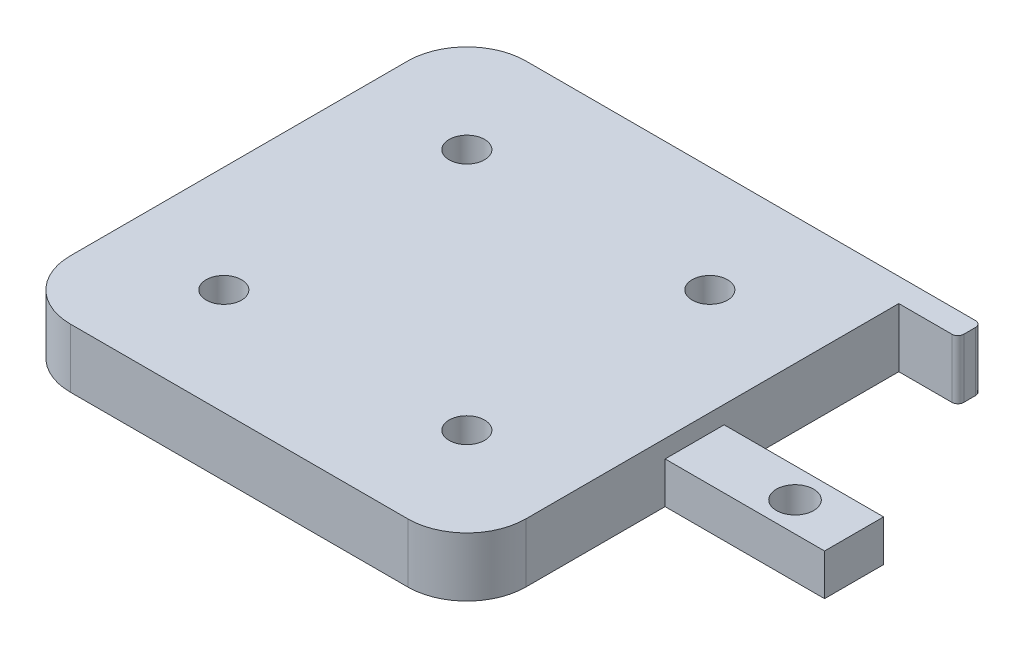
ISO-10303-21;
HEADER;
FILE_DESCRIPTION(('STEP AP214'),'2;1');
FILE_NAME('part.step','',(''),(''),'','','');
FILE_SCHEMA(('AUTOMOTIVE_DESIGN { 1 0 10303 214 1 1 1 1 }'));
ENDSEC;
DATA;
#1=APPLICATION_CONTEXT('core data for automotive mechanical design processes');
#2=APPLICATION_PROTOCOL_DEFINITION('international standard','automotive_design',2000,#1);
#3=PRODUCT_CONTEXT('',#1,'mechanical');
#4=PRODUCT('Part','Part','',(#3));
#5=PRODUCT_RELATED_PRODUCT_CATEGORY('part','',(#4));
#6=PRODUCT_DEFINITION_FORMATION('','',#4);
#7=PRODUCT_DEFINITION_CONTEXT('part definition',#1,'design');
#8=PRODUCT_DEFINITION('design','',#6,#7);
#9=PRODUCT_DEFINITION_SHAPE('','',#8);
#10=(LENGTH_UNIT() NAMED_UNIT(*) SI_UNIT(.MILLI.,.METRE.));
#11=(NAMED_UNIT(*) PLANE_ANGLE_UNIT() SI_UNIT($,.RADIAN.));
#12=(NAMED_UNIT(*) SI_UNIT($,.STERADIAN.) SOLID_ANGLE_UNIT());
#13=UNCERTAINTY_MEASURE_WITH_UNIT(LENGTH_MEASURE(1.E-05),#10,'distance_accuracy_value','');
#14=(GEOMETRIC_REPRESENTATION_CONTEXT(3) GLOBAL_UNCERTAINTY_ASSIGNED_CONTEXT((#13)) GLOBAL_UNIT_ASSIGNED_CONTEXT((#10,
#11,#12)) REPRESENTATION_CONTEXT('',''));
#15=CARTESIAN_POINT('',(0.,0.,0.));
#16=DIRECTION('',(0.,0.,1.));
#17=DIRECTION('',(1.,0.,0.));
#18=AXIS2_PLACEMENT_3D('',#15,#16,#17);
#19=CARTESIAN_POINT('',(38.575,10.,-38.575));
#20=DIRECTION('',(-1.,0.,0.));
#21=DIRECTION('',(0.,0.,1.));
#22=AXIS2_PLACEMENT_3D('',#19,#20,#21);
#23=PLANE('',#22);
#24=DIRECTION('',(0.,-1.,0.));
#25=VECTOR('',#24,1.);
#26=CARTESIAN_POINT('',(38.575,10.,-34.575));
#27=LINE('',#26,#25);
#28=CARTESIAN_POINT('',(38.575,10.,-34.575));
#29=VERTEX_POINT('',#28);
#30=CARTESIAN_POINT('',(38.575,0.,-34.575));
#31=VERTEX_POINT('',#30);
#32=EDGE_CURVE('E140',#29,#31,#27,.T.);
#33=ORIENTED_EDGE('',*,*,#32,.F.);
#34=DIRECTION('',(0.,0.,-1.));
#35=VECTOR('',#34,1.);
#36=CARTESIAN_POINT('',(38.575,10.,-38.575));
#37=LINE('',#36,#35);
#38=CARTESIAN_POINT('',(38.575,10.,28.575));
#39=VERTEX_POINT('',#38);
#40=EDGE_CURVE('E150',#39,#29,#37,.T.);
#41=ORIENTED_EDGE('',*,*,#40,.F.);
#42=DIRECTION('',(0.,-1.,0.));
#43=VECTOR('',#42,1.);
#44=CARTESIAN_POINT('',(38.575,10.,28.575));
#45=LINE('',#44,#43);
#46=CARTESIAN_POINT('',(38.575,0.,28.575));
#47=VERTEX_POINT('',#46);
#48=EDGE_CURVE('E204',#39,#47,#45,.T.);
#49=ORIENTED_EDGE('',*,*,#48,.T.);
#50=DIRECTION('',(0.,0.,-1.));
#51=VECTOR('',#50,1.);
#52=CARTESIAN_POINT('',(38.575,0.,-38.575));
#53=LINE('',#52,#51);
#54=CARTESIAN_POINT('',(38.575,0.,4.99999999999998));
#55=VERTEX_POINT('',#54);
#56=EDGE_CURVE('E178',#47,#55,#53,.T.);
#57=ORIENTED_EDGE('',*,*,#56,.T.);
#58=DIRECTION('',(0.,-1.,0.));
#59=VECTOR('',#58,1.);
#60=CARTESIAN_POINT('',(38.575,7.,5.));
#61=LINE('',#60,#59);
#62=CARTESIAN_POINT('',(38.575,7.,5.));
#63=VERTEX_POINT('',#62);
#64=EDGE_CURVE('E260',#63,#55,#61,.T.);
#65=ORIENTED_EDGE('',*,*,#64,.F.);
#66=DIRECTION('',(0.,0.,1.));
#67=VECTOR('',#66,1.);
#68=CARTESIAN_POINT('',(38.575,7.,-5.));
#69=LINE('',#68,#67);
#70=CARTESIAN_POINT('',(38.575,7.,-5.));
#71=VERTEX_POINT('',#70);
#72=EDGE_CURVE('E257',#71,#63,#69,.T.);
#73=ORIENTED_EDGE('',*,*,#72,.F.);
#74=DIRECTION('',(0.,1.,0.));
#75=VECTOR('',#74,1.);
#76=CARTESIAN_POINT('',(38.575,0.,-5.));
#77=LINE('',#76,#75);
#78=CARTESIAN_POINT('',(38.575,0.,-5.));
#79=VERTEX_POINT('',#78);
#80=EDGE_CURVE('E252',#79,#71,#77,.T.);
#81=ORIENTED_EDGE('',*,*,#80,.F.);
#82=EDGE_CURVE('E154',#79,#31,#53,.T.);
#83=ORIENTED_EDGE('',*,*,#82,.T.);
#84=EDGE_LOOP('',(#33,#41,#49,#57,#65,#73,#81,#83));
#85=FACE_BOUND('',#84,.T.);
#86=ADVANCED_FACE('F32',(#85),#23,.F.);
#87=CARTESIAN_POINT('',(0.,0.,0.));
#88=DIRECTION('',(0.,-1.,0.));
#89=DIRECTION('',(0.,0.,-1.));
#90=AXIS2_PLACEMENT_3D('',#87,#88,#89);
#91=PLANE('',#90);
#92=CARTESIAN_POINT('',(20.575,0.,-20.575));
#93=DIRECTION('',(0.,1.,0.));
#94=DIRECTION('',(0.,0.,1.));
#95=AXIS2_PLACEMENT_3D('',#92,#93,#94);
#96=CIRCLE('',#95,3.);
#97=CARTESIAN_POINT('',(20.575,0.,-17.575));
#98=VERTEX_POINT('',#97);
#99=EDGE_CURVE('E275',#98,#98,#96,.T.);
#100=ORIENTED_EDGE('',*,*,#99,.T.);
#101=EDGE_LOOP('',(#100));
#102=FACE_BOUND('',#101,.T.);
#103=CARTESIAN_POINT('',(-20.575,0.,20.575));
#104=DIRECTION('',(0.,1.,0.));
#105=DIRECTION('',(0.,0.,1.));
#106=AXIS2_PLACEMENT_3D('',#103,#104,#105);
#107=CIRCLE('',#106,3.);
#108=CARTESIAN_POINT('',(-20.575,0.,23.575));
#109=VERTEX_POINT('',#108);
#110=EDGE_CURVE('E287',#109,#109,#107,.T.);
#111=ORIENTED_EDGE('',*,*,#110,.T.);
#112=EDGE_LOOP('',(#111));
#113=FACE_BOUND('',#112,.T.);
#114=CARTESIAN_POINT('',(-20.575,0.,-20.575));
#115=DIRECTION('',(0.,1.,0.));
#116=DIRECTION('',(0.,0.,1.));
#117=AXIS2_PLACEMENT_3D('',#114,#115,#116);
#118=CIRCLE('',#117,3.);
#119=CARTESIAN_POINT('',(-20.575,0.,-17.575));
#120=VERTEX_POINT('',#119);
#121=EDGE_CURVE('E281',#120,#120,#118,.T.);
#122=ORIENTED_EDGE('',*,*,#121,.T.);
#123=EDGE_LOOP('',(#122));
#124=FACE_BOUND('',#123,.T.);
#125=CARTESIAN_POINT('',(20.575,0.,20.575));
#126=DIRECTION('',(0.,1.,0.));
#127=DIRECTION('',(0.,0.,1.));
#128=AXIS2_PLACEMENT_3D('',#125,#126,#127);
#129=CIRCLE('',#128,3.);
#130=CARTESIAN_POINT('',(20.575,0.,23.575));
#131=VERTEX_POINT('',#130);
#132=EDGE_CURVE('E271',#131,#131,#129,.T.);
#133=ORIENTED_EDGE('',*,*,#132,.T.);
#134=EDGE_LOOP('',(#133));
#135=FACE_BOUND('',#134,.T.);
#136=DIRECTION('',(0.,0.,-1.));
#137=VECTOR('',#136,1.);
#138=CARTESIAN_POINT('',(48.575,0.,-34.575));
#139=LINE('',#138,#137);
#140=CARTESIAN_POINT('',(48.575,0.,-35.575));
#141=VERTEX_POINT('',#140);
#142=CARTESIAN_POINT('',(48.575,0.,-37.575));
#143=VERTEX_POINT('',#142);
#144=EDGE_CURVE('E230',#141,#143,#139,.T.);
#145=ORIENTED_EDGE('',*,*,#144,.F.);
#146=CARTESIAN_POINT('',(47.575,0.,-35.575));
#147=DIRECTION('',(0.,-1.,0.));
#148=DIRECTION('',(0.,0.,-1.));
#149=AXIS2_PLACEMENT_3D('',#146,#147,#148);
#150=CIRCLE('',#149,1.);
#151=CARTESIAN_POINT('',(47.575,0.,-34.575));
#152=VERTEX_POINT('',#151);
#153=EDGE_CURVE('E219',#141,#152,#150,.T.);
#154=ORIENTED_EDGE('',*,*,#153,.T.);
#155=DIRECTION('',(-1.,0.,0.));
#156=VECTOR('',#155,1.);
#157=CARTESIAN_POINT('',(48.575,0.,-34.575));
#158=LINE('',#157,#156);
#159=EDGE_CURVE('E145',#152,#31,#158,.T.);
#160=ORIENTED_EDGE('',*,*,#159,.T.);
#161=ORIENTED_EDGE('',*,*,#82,.F.);
#162=DIRECTION('',(-1.,0.,0.));
#163=VECTOR('',#162,1.);
#164=CARTESIAN_POINT('',(68.575,0.,-5.));
#165=LINE('',#164,#163);
#166=CARTESIAN_POINT('',(65.575,0.,-5.));
#167=VERTEX_POINT('',#166);
#168=EDGE_CURVE('E263',#167,#79,#165,.T.);
#169=ORIENTED_EDGE('',*,*,#168,.F.);
#170=DIRECTION('',(0.,0.,1.));
#171=VECTOR('',#170,1.);
#172=CARTESIAN_POINT('',(65.575,0.,0.));
#173=LINE('',#172,#171);
#174=CARTESIAN_POINT('',(65.575,0.,5.));
#175=VERTEX_POINT('',#174);
#176=EDGE_CURVE('E245',#167,#175,#173,.T.);
#177=ORIENTED_EDGE('',*,*,#176,.T.);
#178=DIRECTION('',(-1.,0.,0.));
#179=VECTOR('',#178,1.);
#180=CARTESIAN_POINT('',(68.575,0.,5.));
#181=LINE('',#180,#179);
#182=EDGE_CURVE('E265',#175,#55,#181,.T.);
#183=ORIENTED_EDGE('',*,*,#182,.T.);
#184=ORIENTED_EDGE('',*,*,#56,.F.);
#185=CARTESIAN_POINT('',(28.575,0.,28.575));
#186=DIRECTION('',(0.,-1.,0.));
#187=DIRECTION('',(0.,0.,-1.));
#188=AXIS2_PLACEMENT_3D('',#185,#186,#187);
#189=CIRCLE('',#188,10.);
#190=CARTESIAN_POINT('',(28.575,0.,38.575));
#191=VERTEX_POINT('',#190);
#192=EDGE_CURVE('E191',#47,#191,#189,.T.);
#193=ORIENTED_EDGE('',*,*,#192,.T.);
#194=DIRECTION('',(1.,0.,0.));
#195=VECTOR('',#194,1.);
#196=CARTESIAN_POINT('',(38.575,0.,38.575));
#197=LINE('',#196,#195);
#198=CARTESIAN_POINT('',(-28.575,0.,38.575));
#199=VERTEX_POINT('',#198);
#200=EDGE_CURVE('E174',#199,#191,#197,.T.);
#201=ORIENTED_EDGE('',*,*,#200,.F.);
#202=CARTESIAN_POINT('',(-28.575,0.,28.575));
#203=DIRECTION('',(0.,-1.,0.));
#204=DIRECTION('',(0.,0.,-1.));
#205=AXIS2_PLACEMENT_3D('',#202,#203,#204);
#206=CIRCLE('',#205,10.);
#207=CARTESIAN_POINT('',(-38.575,0.,28.575));
#208=VERTEX_POINT('',#207);
#209=EDGE_CURVE('E189',#199,#208,#206,.T.);
#210=ORIENTED_EDGE('',*,*,#209,.T.);
#211=DIRECTION('',(0.,0.,1.));
#212=VECTOR('',#211,1.);
#213=CARTESIAN_POINT('',(-38.575,0.,38.575));
#214=LINE('',#213,#212);
#215=CARTESIAN_POINT('',(-38.575,0.,-28.575));
#216=VERTEX_POINT('',#215);
#217=EDGE_CURVE('E167',#216,#208,#214,.T.);
#218=ORIENTED_EDGE('',*,*,#217,.F.);
#219=CARTESIAN_POINT('',(-28.575,0.,-28.575));
#220=DIRECTION('',(0.,-1.,0.));
#221=DIRECTION('',(0.,0.,-1.));
#222=AXIS2_PLACEMENT_3D('',#219,#220,#221);
#223=CIRCLE('',#222,10.);
#224=CARTESIAN_POINT('',(-28.575,0.,-38.575));
#225=VERTEX_POINT('',#224);
#226=EDGE_CURVE('E193',#216,#225,#223,.T.);
#227=ORIENTED_EDGE('',*,*,#226,.T.);
#228=DIRECTION('',(-1.,0.,0.));
#229=VECTOR('',#228,1.);
#230=CARTESIAN_POINT('',(-38.575,0.,-38.575));
#231=LINE('',#230,#229);
#232=CARTESIAN_POINT('',(47.575,0.,-38.575));
#233=VERTEX_POINT('',#232);
#234=EDGE_CURVE('E181',#233,#225,#231,.T.);
#235=ORIENTED_EDGE('',*,*,#234,.F.);
#236=CARTESIAN_POINT('',(47.575,0.,-37.575));
#237=DIRECTION('',(0.,-1.,0.));
#238=DIRECTION('',(0.,0.,-1.));
#239=AXIS2_PLACEMENT_3D('',#236,#237,#238);
#240=CIRCLE('',#239,1.);
#241=EDGE_CURVE('E217',#233,#143,#240,.T.);
#242=ORIENTED_EDGE('',*,*,#241,.T.);
#243=EDGE_LOOP('',(#145,#154,#160,#161,#169,#177,#183,#184,#193,#201,#210,#218,#227,#235,#242));
#244=FACE_BOUND('',#243,.T.);
#245=ADVANCED_FACE('F234',(#102,#113,#124,#135,#244),#91,.T.);
#246=CARTESIAN_POINT('',(68.575,0.,-5.));
#247=DIRECTION('',(0.,0.,1.));
#248=DIRECTION('',(1.,0.,0.));
#249=AXIS2_PLACEMENT_3D('',#246,#247,#248);
#250=PLANE('',#249);
#251=DIRECTION('',(0.,1.,0.));
#252=VECTOR('',#251,1.);
#253=CARTESIAN_POINT('',(65.575,-36.,-5.));
#254=LINE('',#253,#252);
#255=CARTESIAN_POINT('',(65.575,7.,-5.));
#256=VERTEX_POINT('',#255);
#257=EDGE_CURVE('E240',#167,#256,#254,.T.);
#258=ORIENTED_EDGE('',*,*,#257,.F.);
#259=ORIENTED_EDGE('',*,*,#168,.T.);
#260=ORIENTED_EDGE('',*,*,#80,.T.);
#261=DIRECTION('',(-1.,0.,0.));
#262=VECTOR('',#261,1.);
#263=CARTESIAN_POINT('',(68.575,7.,-5.));
#264=LINE('',#263,#262);
#265=EDGE_CURVE('E269',#256,#71,#264,.T.);
#266=ORIENTED_EDGE('',*,*,#265,.F.);
#267=EDGE_LOOP('',(#258,#259,#260,#266));
#268=FACE_BOUND('',#267,.T.);
#269=ADVANCED_FACE('F318',(#268),#250,.F.);
#270=CARTESIAN_POINT('',(68.575,7.,-5.));
#271=DIRECTION('',(0.,-1.,0.));
#272=DIRECTION('',(0.,0.,-1.));
#273=AXIS2_PLACEMENT_3D('',#270,#271,#272);
#274=PLANE('',#273);
#275=CARTESIAN_POINT('',(55.575,7.,0.));
#276=DIRECTION('',(0.,-1.,0.));
#277=DIRECTION('',(0.,0.,-1.));
#278=AXIS2_PLACEMENT_3D('',#275,#276,#277);
#279=CIRCLE('',#278,3.15);
#280=CARTESIAN_POINT('',(55.575,7.,-3.15));
#281=VERTEX_POINT('',#280);
#282=EDGE_CURVE('E248',#281,#281,#279,.T.);
#283=ORIENTED_EDGE('',*,*,#282,.T.);
#284=EDGE_LOOP('',(#283));
#285=FACE_BOUND('',#284,.T.);
#286=DIRECTION('',(0.,0.,-1.));
#287=VECTOR('',#286,1.);
#288=CARTESIAN_POINT('',(65.575,7.,-5.));
#289=LINE('',#288,#287);
#290=CARTESIAN_POINT('',(65.575,7.,5.));
#291=VERTEX_POINT('',#290);
#292=EDGE_CURVE('E144',#291,#256,#289,.T.);
#293=ORIENTED_EDGE('',*,*,#292,.T.);
#294=ORIENTED_EDGE('',*,*,#265,.T.);
#295=ORIENTED_EDGE('',*,*,#72,.T.);
#296=DIRECTION('',(-1.,0.,0.));
#297=VECTOR('',#296,1.);
#298=CARTESIAN_POINT('',(68.575,7.,5.));
#299=LINE('',#298,#297);
#300=EDGE_CURVE('E267',#291,#63,#299,.T.);
#301=ORIENTED_EDGE('',*,*,#300,.F.);
#302=EDGE_LOOP('',(#293,#294,#295,#301));
#303=FACE_BOUND('',#302,.T.);
#304=ADVANCED_FACE('F366',(#285,#303),#274,.F.);
#305=CARTESIAN_POINT('',(68.575,7.,5.));
#306=DIRECTION('',(0.,0.,-1.));
#307=DIRECTION('',(0.,1.,0.));
#308=AXIS2_PLACEMENT_3D('',#305,#306,#307);
#309=PLANE('',#308);
#310=DIRECTION('',(0.,1.,0.));
#311=VECTOR('',#310,1.);
#312=CARTESIAN_POINT('',(65.575,-36.,5.));
#313=LINE('',#312,#311);
#314=EDGE_CURVE('E242',#175,#291,#313,.T.);
#315=ORIENTED_EDGE('',*,*,#314,.T.);
#316=ORIENTED_EDGE('',*,*,#300,.T.);
#317=ORIENTED_EDGE('',*,*,#64,.T.);
#318=ORIENTED_EDGE('',*,*,#182,.F.);
#319=EDGE_LOOP('',(#315,#316,#317,#318));
#320=FACE_BOUND('',#319,.T.);
#321=ADVANCED_FACE('F363',(#320),#309,.F.);
#322=CARTESIAN_POINT('',(0.,10.,0.));
#323=DIRECTION('',(0.,-1.,0.));
#324=DIRECTION('',(0.,0.,-1.));
#325=AXIS2_PLACEMENT_3D('',#322,#323,#324);
#326=PLANE('',#325);
#327=DIRECTION('',(-1.,0.,0.));
#328=VECTOR('',#327,1.);
#329=CARTESIAN_POINT('',(48.575,10.,-34.575));
#330=LINE('',#329,#328);
#331=CARTESIAN_POINT('',(47.575,10.,-34.575));
#332=VERTEX_POINT('',#331);
#333=EDGE_CURVE('E137',#332,#29,#330,.T.);
#334=ORIENTED_EDGE('',*,*,#333,.F.);
#335=CARTESIAN_POINT('',(47.575,10.,-35.575));
#336=DIRECTION('',(0.,-1.,0.));
#337=DIRECTION('',(0.,0.,-1.));
#338=AXIS2_PLACEMENT_3D('',#335,#336,#337);
#339=CIRCLE('',#338,1.);
#340=CARTESIAN_POINT('',(48.575,10.,-35.575));
#341=VERTEX_POINT('',#340);
#342=EDGE_CURVE('E40',#332,#341,#339,.F.);
#343=ORIENTED_EDGE('',*,*,#342,.T.);
#344=DIRECTION('',(0.,0.,1.));
#345=VECTOR('',#344,1.);
#346=CARTESIAN_POINT('',(48.575,10.,-38.575));
#347=LINE('',#346,#345);
#348=CARTESIAN_POINT('',(48.575,10.,-37.575));
#349=VERTEX_POINT('',#348);
#350=EDGE_CURVE('E155',#349,#341,#347,.T.);
#351=ORIENTED_EDGE('',*,*,#350,.F.);
#352=CARTESIAN_POINT('',(47.575,10.,-37.575));
#353=DIRECTION('',(0.,-1.,0.));
#354=DIRECTION('',(0.,0.,-1.));
#355=AXIS2_PLACEMENT_3D('',#352,#353,#354);
#356=CIRCLE('',#355,1.);
#357=CARTESIAN_POINT('',(47.575,10.,-38.575));
#358=VERTEX_POINT('',#357);
#359=EDGE_CURVE('E47',#349,#358,#356,.F.);
#360=ORIENTED_EDGE('',*,*,#359,.T.);
#361=DIRECTION('',(-1.,0.,0.));
#362=VECTOR('',#361,1.);
#363=CARTESIAN_POINT('',(-38.575,10.,-38.575));
#364=LINE('',#363,#362);
#365=CARTESIAN_POINT('',(-28.575,10.,-38.575));
#366=VERTEX_POINT('',#365);
#367=EDGE_CURVE('E162',#358,#366,#364,.T.);
#368=ORIENTED_EDGE('',*,*,#367,.T.);
#369=CARTESIAN_POINT('',(-28.575,10.,-28.575));
#370=DIRECTION('',(0.,-1.,0.));
#371=DIRECTION('',(0.,0.,-1.));
#372=AXIS2_PLACEMENT_3D('',#369,#370,#371);
#373=CIRCLE('',#372,10.);
#374=CARTESIAN_POINT('',(-38.575,10.,-28.575));
#375=VERTEX_POINT('',#374);
#376=EDGE_CURVE('E202',#366,#375,#373,.F.);
#377=ORIENTED_EDGE('',*,*,#376,.T.);
#378=DIRECTION('',(0.,0.,1.));
#379=VECTOR('',#378,1.);
#380=CARTESIAN_POINT('',(-38.575,10.,38.575));
#381=LINE('',#380,#379);
#382=CARTESIAN_POINT('',(-38.575,10.,28.575));
#383=VERTEX_POINT('',#382);
#384=EDGE_CURVE('E165',#375,#383,#381,.T.);
#385=ORIENTED_EDGE('',*,*,#384,.T.);
#386=CARTESIAN_POINT('',(-28.575,10.,28.575));
#387=DIRECTION('',(0.,-1.,0.));
#388=DIRECTION('',(0.,0.,-1.));
#389=AXIS2_PLACEMENT_3D('',#386,#387,#388);
#390=CIRCLE('',#389,10.);
#391=CARTESIAN_POINT('',(-28.575,10.,38.575));
#392=VERTEX_POINT('',#391);
#393=EDGE_CURVE('E199',#383,#392,#390,.F.);
#394=ORIENTED_EDGE('',*,*,#393,.T.);
#395=DIRECTION('',(1.,0.,0.));
#396=VECTOR('',#395,1.);
#397=CARTESIAN_POINT('',(38.575,10.,38.575));
#398=LINE('',#397,#396);
#399=CARTESIAN_POINT('',(28.575,10.,38.575));
#400=VERTEX_POINT('',#399);
#401=EDGE_CURVE('E163',#392,#400,#398,.T.);
#402=ORIENTED_EDGE('',*,*,#401,.T.);
#403=CARTESIAN_POINT('',(28.575,10.,28.575));
#404=DIRECTION('',(0.,-1.,0.));
#405=DIRECTION('',(0.,0.,-1.));
#406=AXIS2_PLACEMENT_3D('',#403,#404,#405);
#407=CIRCLE('',#406,10.);
#408=EDGE_CURVE('E161',#400,#39,#407,.F.);
#409=ORIENTED_EDGE('',*,*,#408,.T.);
#410=ORIENTED_EDGE('',*,*,#40,.T.);
#411=EDGE_LOOP('',(#334,#343,#351,#360,#368,#377,#385,#394,#402,#409,#410));
#412=FACE_BOUND('',#411,.T.);
#413=CARTESIAN_POINT('',(-20.575,10.,20.575));
#414=DIRECTION('',(0.,1.,0.));
#415=DIRECTION('',(0.,0.,1.));
#416=AXIS2_PLACEMENT_3D('',#413,#414,#415);
#417=CIRCLE('',#416,3.);
#418=CARTESIAN_POINT('',(-20.575,10.,23.575));
#419=VERTEX_POINT('',#418);
#420=EDGE_CURVE('E177',#419,#419,#417,.T.);
#421=ORIENTED_EDGE('',*,*,#420,.F.);
#422=EDGE_LOOP('',(#421));
#423=FACE_BOUND('',#422,.T.);
#424=CARTESIAN_POINT('',(-20.575,10.,-20.575));
#425=DIRECTION('',(0.,1.,0.));
#426=DIRECTION('',(0.,0.,1.));
#427=AXIS2_PLACEMENT_3D('',#424,#425,#426);
#428=CIRCLE('',#427,3.);
#429=CARTESIAN_POINT('',(-20.575,10.,-17.575));
#430=VERTEX_POINT('',#429);
#431=EDGE_CURVE('E284',#430,#430,#428,.T.);
#432=ORIENTED_EDGE('',*,*,#431,.F.);
#433=EDGE_LOOP('',(#432));
#434=FACE_BOUND('',#433,.T.);
#435=CARTESIAN_POINT('',(20.575,10.,-20.575));
#436=DIRECTION('',(0.,1.,0.));
#437=DIRECTION('',(0.,0.,1.));
#438=AXIS2_PLACEMENT_3D('',#435,#436,#437);
#439=CIRCLE('',#438,3.);
#440=CARTESIAN_POINT('',(20.575,10.,-17.575));
#441=VERTEX_POINT('',#440);
#442=EDGE_CURVE('E278',#441,#441,#439,.T.);
#443=ORIENTED_EDGE('',*,*,#442,.F.);
#444=EDGE_LOOP('',(#443));
#445=FACE_BOUND('',#444,.T.);
#446=CARTESIAN_POINT('',(20.575,10.,20.575));
#447=DIRECTION('',(0.,1.,0.));
#448=DIRECTION('',(0.,0.,1.));
#449=AXIS2_PLACEMENT_3D('',#446,#447,#448);
#450=CIRCLE('',#449,3.);
#451=CARTESIAN_POINT('',(20.575,10.,23.575));
#452=VERTEX_POINT('',#451);
#453=EDGE_CURVE('E272',#452,#452,#450,.T.);
#454=ORIENTED_EDGE('',*,*,#453,.F.);
#455=EDGE_LOOP('',(#454));
#456=FACE_BOUND('',#455,.T.);
#457=ADVANCED_FACE('F157',(#412,#423,#434,#445,#456),#326,.F.);
#458=CARTESIAN_POINT('',(38.575,10.,38.575));
#459=DIRECTION('',(0.,0.,-1.));
#460=DIRECTION('',(-1.,0.,0.));
#461=AXIS2_PLACEMENT_3D('',#458,#459,#460);
#462=PLANE('',#461);
#463=ORIENTED_EDGE('',*,*,#200,.T.);
#464=DIRECTION('',(0.,-1.,0.));
#465=VECTOR('',#464,1.);
#466=CARTESIAN_POINT('',(28.575,10.,38.575));
#467=LINE('',#466,#465);
#468=EDGE_CURVE('E209',#191,#400,#467,.F.);
#469=ORIENTED_EDGE('',*,*,#468,.T.);
#470=ORIENTED_EDGE('',*,*,#401,.F.);
#471=DIRECTION('',(0.,-1.,0.));
#472=VECTOR('',#471,1.);
#473=CARTESIAN_POINT('',(-28.575,10.,38.575));
#474=LINE('',#473,#472);
#475=EDGE_CURVE('E206',#392,#199,#474,.T.);
#476=ORIENTED_EDGE('',*,*,#475,.T.);
#477=EDGE_LOOP('',(#463,#469,#470,#476));
#478=FACE_BOUND('',#477,.T.);
#479=ADVANCED_FACE('F323',(#478),#462,.F.);
#480=CARTESIAN_POINT('',(-38.575,10.,-38.575));
#481=DIRECTION('',(0.,0.,1.));
#482=DIRECTION('',(1.,0.,0.));
#483=AXIS2_PLACEMENT_3D('',#480,#481,#482);
#484=PLANE('',#483);
#485=ORIENTED_EDGE('',*,*,#367,.F.);
#486=DIRECTION('',(0.,1.,0.));
#487=VECTOR('',#486,1.);
#488=CARTESIAN_POINT('',(47.575,0.,-38.575));
#489=LINE('',#488,#487);
#490=EDGE_CURVE('E11',#358,#233,#489,.F.);
#491=ORIENTED_EDGE('',*,*,#490,.T.);
#492=ORIENTED_EDGE('',*,*,#234,.T.);
#493=DIRECTION('',(0.,-1.,0.));
#494=VECTOR('',#493,1.);
#495=CARTESIAN_POINT('',(-28.575,10.,-38.575));
#496=LINE('',#495,#494);
#497=EDGE_CURVE('E196',#225,#366,#496,.F.);
#498=ORIENTED_EDGE('',*,*,#497,.T.);
#499=EDGE_LOOP('',(#485,#491,#492,#498));
#500=FACE_BOUND('',#499,.T.);
#501=ADVANCED_FACE('F309',(#500),#484,.F.);
#502=CARTESIAN_POINT('',(-38.575,10.,38.575));
#503=DIRECTION('',(1.,0.,0.));
#504=DIRECTION('',(0.,0.,-1.));
#505=AXIS2_PLACEMENT_3D('',#502,#503,#504);
#506=PLANE('',#505);
#507=ORIENTED_EDGE('',*,*,#384,.F.);
#508=DIRECTION('',(0.,-1.,0.));
#509=VECTOR('',#508,1.);
#510=CARTESIAN_POINT('',(-38.575,10.,-28.575));
#511=LINE('',#510,#509);
#512=EDGE_CURVE('E186',#375,#216,#511,.T.);
#513=ORIENTED_EDGE('',*,*,#512,.T.);
#514=ORIENTED_EDGE('',*,*,#217,.T.);
#515=DIRECTION('',(0.,-1.,0.));
#516=VECTOR('',#515,1.);
#517=CARTESIAN_POINT('',(-38.575,10.,28.575));
#518=LINE('',#517,#516);
#519=EDGE_CURVE('E173',#208,#383,#518,.F.);
#520=ORIENTED_EDGE('',*,*,#519,.T.);
#521=EDGE_LOOP('',(#507,#513,#514,#520));
#522=FACE_BOUND('',#521,.T.);
#523=ADVANCED_FACE('F299',(#522),#506,.F.);
#524=CARTESIAN_POINT('',(-20.575,10.,20.575));
#525=DIRECTION('',(0.,-1.,0.));
#526=DIRECTION('',(0.,0.,-1.));
#527=AXIS2_PLACEMENT_3D('',#524,#525,#526);
#528=CYLINDRICAL_SURFACE('',#527,3.);
#529=ORIENTED_EDGE('',*,*,#420,.T.);
#530=EDGE_LOOP('',(#529));
#531=FACE_BOUND('',#530,.T.);
#532=ORIENTED_EDGE('',*,*,#110,.F.);
#533=EDGE_LOOP('',(#532));
#534=FACE_BOUND('',#533,.T.);
#535=ADVANCED_FACE('F296',(#531,#534),#528,.F.);
#536=CARTESIAN_POINT('',(-20.575,10.,-20.575));
#537=DIRECTION('',(0.,-1.,0.));
#538=DIRECTION('',(0.,0.,-1.));
#539=AXIS2_PLACEMENT_3D('',#536,#537,#538);
#540=CYLINDRICAL_SURFACE('',#539,3.);
#541=ORIENTED_EDGE('',*,*,#431,.T.);
#542=EDGE_LOOP('',(#541));
#543=FACE_BOUND('',#542,.T.);
#544=ORIENTED_EDGE('',*,*,#121,.F.);
#545=EDGE_LOOP('',(#544));
#546=FACE_BOUND('',#545,.T.);
#547=ADVANCED_FACE('F298',(#543,#546),#540,.F.);
#548=CARTESIAN_POINT('',(20.575,10.,-20.575));
#549=DIRECTION('',(0.,-1.,0.));
#550=DIRECTION('',(0.,0.,-1.));
#551=AXIS2_PLACEMENT_3D('',#548,#549,#550);
#552=CYLINDRICAL_SURFACE('',#551,3.);
#553=ORIENTED_EDGE('',*,*,#442,.T.);
#554=EDGE_LOOP('',(#553));
#555=FACE_BOUND('',#554,.T.);
#556=ORIENTED_EDGE('',*,*,#99,.F.);
#557=EDGE_LOOP('',(#556));
#558=FACE_BOUND('',#557,.T.);
#559=ADVANCED_FACE('F306',(#555,#558),#552,.F.);
#560=CARTESIAN_POINT('',(20.575,10.,20.575));
#561=DIRECTION('',(0.,-1.,0.));
#562=DIRECTION('',(0.,0.,-1.));
#563=AXIS2_PLACEMENT_3D('',#560,#561,#562);
#564=CYLINDRICAL_SURFACE('',#563,3.);
#565=ORIENTED_EDGE('',*,*,#453,.T.);
#566=EDGE_LOOP('',(#565));
#567=FACE_BOUND('',#566,.T.);
#568=ORIENTED_EDGE('',*,*,#132,.F.);
#569=EDGE_LOOP('',(#568));
#570=FACE_BOUND('',#569,.T.);
#571=ADVANCED_FACE('F331',(#567,#570),#564,.F.);
#572=CARTESIAN_POINT('',(-28.575,10.,-28.575));
#573=DIRECTION('',(0.,-1.,0.));
#574=DIRECTION('',(0.,0.,-1.));
#575=AXIS2_PLACEMENT_3D('',#572,#573,#574);
#576=CYLINDRICAL_SURFACE('',#575,10.);
#577=ORIENTED_EDGE('',*,*,#376,.F.);
#578=ORIENTED_EDGE('',*,*,#497,.F.);
#579=ORIENTED_EDGE('',*,*,#226,.F.);
#580=ORIENTED_EDGE('',*,*,#512,.F.);
#581=EDGE_LOOP('',(#577,#578,#579,#580));
#582=FACE_BOUND('',#581,.T.);
#583=ADVANCED_FACE('F327',(#582),#576,.T.);
#584=CARTESIAN_POINT('',(28.575,10.,28.575));
#585=DIRECTION('',(0.,-1.,0.));
#586=DIRECTION('',(0.,0.,-1.));
#587=AXIS2_PLACEMENT_3D('',#584,#585,#586);
#588=CYLINDRICAL_SURFACE('',#587,10.);
#589=ORIENTED_EDGE('',*,*,#408,.F.);
#590=ORIENTED_EDGE('',*,*,#468,.F.);
#591=ORIENTED_EDGE('',*,*,#192,.F.);
#592=ORIENTED_EDGE('',*,*,#48,.F.);
#593=EDGE_LOOP('',(#589,#590,#591,#592));
#594=FACE_BOUND('',#593,.T.);
#595=ADVANCED_FACE('F330',(#594),#588,.T.);
#596=CARTESIAN_POINT('',(-28.575,10.,28.575));
#597=DIRECTION('',(0.,-1.,0.));
#598=DIRECTION('',(0.,0.,-1.));
#599=AXIS2_PLACEMENT_3D('',#596,#597,#598);
#600=CYLINDRICAL_SURFACE('',#599,10.);
#601=ORIENTED_EDGE('',*,*,#393,.F.);
#602=ORIENTED_EDGE('',*,*,#519,.F.);
#603=ORIENTED_EDGE('',*,*,#209,.F.);
#604=ORIENTED_EDGE('',*,*,#475,.F.);
#605=EDGE_LOOP('',(#601,#602,#603,#604));
#606=FACE_BOUND('',#605,.T.);
#607=ADVANCED_FACE('F335',(#606),#600,.T.);
#608=CARTESIAN_POINT('',(55.575,2.,0.));
#609=DIRECTION('',(0.,1.,0.));
#610=DIRECTION('',(0.,0.,1.));
#611=AXIS2_PLACEMENT_3D('',#608,#609,#610);
#612=CYLINDRICAL_SURFACE('',#611,3.15);
#613=CARTESIAN_POINT('',(55.575,2.,0.));
#614=DIRECTION('',(0.,-1.,0.));
#615=DIRECTION('',(0.,0.,-1.));
#616=AXIS2_PLACEMENT_3D('',#613,#614,#615);
#617=CIRCLE('',#616,3.15);
#618=CARTESIAN_POINT('',(55.575,2.,-3.15));
#619=VERTEX_POINT('',#618);
#620=EDGE_CURVE('E249',#619,#619,#617,.T.);
#621=ORIENTED_EDGE('',*,*,#620,.T.);
#622=EDGE_LOOP('',(#621));
#623=FACE_BOUND('',#622,.T.);
#624=ORIENTED_EDGE('',*,*,#282,.F.);
#625=EDGE_LOOP('',(#624));
#626=FACE_BOUND('',#625,.T.);
#627=ADVANCED_FACE('F338',(#623,#626),#612,.F.);
#628=CARTESIAN_POINT('',(55.575,2.,0.));
#629=DIRECTION('',(0.,-1.,0.));
#630=DIRECTION('',(0.,0.,-1.));
#631=AXIS2_PLACEMENT_3D('',#628,#629,#630);
#632=PLANE('',#631);
#633=ORIENTED_EDGE('',*,*,#620,.F.);
#634=EDGE_LOOP('',(#633));
#635=FACE_BOUND('',#634,.T.);
#636=ADVANCED_FACE('F355',(#635),#632,.F.);
#637=CARTESIAN_POINT('',(65.575,-36.,-5.));
#638=DIRECTION('',(1.,0.,0.));
#639=DIRECTION('',(0.,0.,-1.));
#640=AXIS2_PLACEMENT_3D('',#637,#638,#639);
#641=PLANE('',#640);
#642=ORIENTED_EDGE('',*,*,#257,.T.);
#643=ORIENTED_EDGE('',*,*,#292,.F.);
#644=ORIENTED_EDGE('',*,*,#314,.F.);
#645=ORIENTED_EDGE('',*,*,#176,.F.);
#646=EDGE_LOOP('',(#642,#643,#644,#645));
#647=FACE_BOUND('',#646,.T.);
#648=ADVANCED_FACE('F350',(#647),#641,.T.);
#649=CARTESIAN_POINT('',(48.575,10.,-34.575));
#650=DIRECTION('',(0.,0.,-1.));
#651=DIRECTION('',(-1.,0.,0.));
#652=AXIS2_PLACEMENT_3D('',#649,#650,#651);
#653=PLANE('',#652);
#654=ORIENTED_EDGE('',*,*,#159,.F.);
#655=DIRECTION('',(0.,-1.,0.));
#656=VECTOR('',#655,1.);
#657=CARTESIAN_POINT('',(47.575,10.,-34.575));
#658=LINE('',#657,#656);
#659=EDGE_CURVE('E55',#152,#332,#658,.F.);
#660=ORIENTED_EDGE('',*,*,#659,.T.);
#661=ORIENTED_EDGE('',*,*,#333,.T.);
#662=ORIENTED_EDGE('',*,*,#32,.T.);
#663=EDGE_LOOP('',(#654,#660,#661,#662));
#664=FACE_BOUND('',#663,.T.);
#665=ADVANCED_FACE('F139',(#664),#653,.F.);
#666=CARTESIAN_POINT('',(48.575,0.,0.));
#667=DIRECTION('',(1.,0.,0.));
#668=DIRECTION('',(0.,0.,-1.));
#669=AXIS2_PLACEMENT_3D('',#666,#667,#668);
#670=PLANE('',#669);
#671=ORIENTED_EDGE('',*,*,#350,.T.);
#672=DIRECTION('',(0.,-1.,0.));
#673=VECTOR('',#672,1.);
#674=CARTESIAN_POINT('',(48.575,0.,-35.575));
#675=LINE('',#674,#673);
#676=EDGE_CURVE('E214',#341,#141,#675,.T.);
#677=ORIENTED_EDGE('',*,*,#676,.T.);
#678=ORIENTED_EDGE('',*,*,#144,.T.);
#679=DIRECTION('',(0.,1.,0.));
#680=VECTOR('',#679,1.);
#681=CARTESIAN_POINT('',(48.575,10.,-37.575));
#682=LINE('',#681,#680);
#683=EDGE_CURVE('E211',#143,#349,#682,.T.);
#684=ORIENTED_EDGE('',*,*,#683,.T.);
#685=EDGE_LOOP('',(#671,#677,#678,#684));
#686=FACE_BOUND('',#685,.T.);
#687=ADVANCED_FACE('F226',(#686),#670,.T.);
#688=CARTESIAN_POINT('',(47.575,0.,-35.575));
#689=DIRECTION('',(0.,1.,0.));
#690=DIRECTION('',(0.,0.,1.));
#691=AXIS2_PLACEMENT_3D('',#688,#689,#690);
#692=CYLINDRICAL_SURFACE('',#691,1.);
#693=ORIENTED_EDGE('',*,*,#342,.F.);
#694=ORIENTED_EDGE('',*,*,#659,.F.);
#695=ORIENTED_EDGE('',*,*,#153,.F.);
#696=ORIENTED_EDGE('',*,*,#676,.F.);
#697=EDGE_LOOP('',(#693,#694,#695,#696));
#698=FACE_BOUND('',#697,.T.);
#699=ADVANCED_FACE('F232',(#698),#692,.T.);
#700=CARTESIAN_POINT('',(47.575,0.,-37.575));
#701=DIRECTION('',(0.,-1.,0.));
#702=DIRECTION('',(0.,0.,-1.));
#703=AXIS2_PLACEMENT_3D('',#700,#701,#702);
#704=CYLINDRICAL_SURFACE('',#703,1.);
#705=ORIENTED_EDGE('',*,*,#241,.F.);
#706=ORIENTED_EDGE('',*,*,#490,.F.);
#707=ORIENTED_EDGE('',*,*,#359,.F.);
#708=ORIENTED_EDGE('',*,*,#683,.F.);
#709=EDGE_LOOP('',(#705,#706,#707,#708));
#710=FACE_BOUND('',#709,.T.);
#711=ADVANCED_FACE('F34',(#710),#704,.T.);
#712=CLOSED_SHELL('',(#86,#245,#269,#304,#321,#457,#479,#501,#523,#535,#547,#559,#571,#583,#595,
#607,#627,#636,#648,#665,#687,#699,#711));
#713=MANIFOLD_SOLID_BREP('B2',#712);
#714=ADVANCED_BREP_SHAPE_REPRESENTATION('',(#18,#713),#14);
#715=SHAPE_DEFINITION_REPRESENTATION(#9,#714);
ENDSEC;
END-ISO-10303-21;
